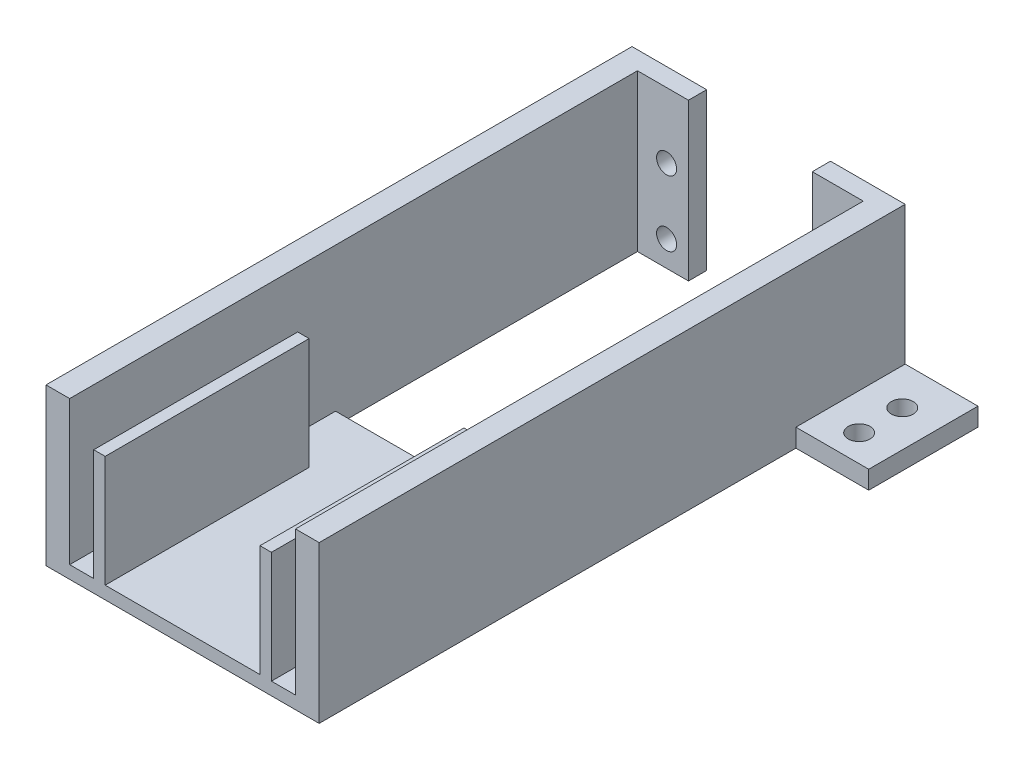
ISO-10303-21;
HEADER;
FILE_DESCRIPTION(('STEP AP214'),'2;1');
FILE_NAME('part.step','',(''),(''),'','','');
FILE_SCHEMA(('AUTOMOTIVE_DESIGN { 1 0 10303 214 1 1 1 1 }'));
ENDSEC;
DATA;
#1=APPLICATION_CONTEXT('core data for automotive mechanical design processes');
#2=APPLICATION_PROTOCOL_DEFINITION('international standard','automotive_design',2000,#1);
#3=PRODUCT_CONTEXT('',#1,'mechanical');
#4=PRODUCT('Part','Part','',(#3));
#5=PRODUCT_RELATED_PRODUCT_CATEGORY('part','',(#4));
#6=PRODUCT_DEFINITION_FORMATION('','',#4);
#7=PRODUCT_DEFINITION_CONTEXT('part definition',#1,'design');
#8=PRODUCT_DEFINITION('design','',#6,#7);
#9=PRODUCT_DEFINITION_SHAPE('','',#8);
#10=(LENGTH_UNIT() NAMED_UNIT(*) SI_UNIT(.MILLI.,.METRE.));
#11=(NAMED_UNIT(*) PLANE_ANGLE_UNIT() SI_UNIT($,.RADIAN.));
#12=(NAMED_UNIT(*) SI_UNIT($,.STERADIAN.) SOLID_ANGLE_UNIT());
#13=UNCERTAINTY_MEASURE_WITH_UNIT(LENGTH_MEASURE(1.E-05),#10,'distance_accuracy_value','');
#14=(GEOMETRIC_REPRESENTATION_CONTEXT(3) GLOBAL_UNCERTAINTY_ASSIGNED_CONTEXT((#13)) GLOBAL_UNIT_ASSIGNED_CONTEXT((#10,
#11,#12)) REPRESENTATION_CONTEXT('',''));
#15=CARTESIAN_POINT('',(0.,0.,0.));
#16=DIRECTION('',(0.,0.,1.));
#17=DIRECTION('',(1.,0.,0.));
#18=AXIS2_PLACEMENT_3D('',#15,#16,#17);
#19=CARTESIAN_POINT('',(3.60000000000001,3.50000000000002,167.9));
#20=DIRECTION('',(0.,-1.,0.));
#21=DIRECTION('',(0.,0.,-1.));
#22=AXIS2_PLACEMENT_3D('',#19,#20,#21);
#23=PLANE('',#22);
#24=DIRECTION('',(-1.,0.,0.));
#25=VECTOR('',#24,1.);
#26=CARTESIAN_POINT('',(3.60000000000001,3.50000000000002,160.9));
#27=LINE('',#26,#25);
#28=CARTESIAN_POINT('',(68.5,3.50000000000002,160.9));
#29=VERTEX_POINT('',#28);
#30=CARTESIAN_POINT('',(61.8901200344411,3.50000000000001,160.9));
#31=VERTEX_POINT('',#30);
#32=EDGE_CURVE('E616',#29,#31,#27,.T.);
#33=ORIENTED_EDGE('',*,*,#32,.F.);
#34=DIRECTION('',(0.,0.,-1.));
#35=VECTOR('',#34,1.);
#36=CARTESIAN_POINT('',(68.5,3.50000000000002,167.9));
#37=LINE('',#36,#35);
#38=CARTESIAN_POINT('',(68.5,3.50000000000001,87.9));
#39=VERTEX_POINT('',#38);
#40=EDGE_CURVE('E295',#29,#39,#37,.T.);
#41=ORIENTED_EDGE('',*,*,#40,.T.);
#42=DIRECTION('',(1.,0.,0.));
#43=VECTOR('',#42,1.);
#44=CARTESIAN_POINT('',(3.60000000000001,3.50000000000001,87.9));
#45=LINE('',#44,#43);
#46=CARTESIAN_POINT('',(6.5,3.50000000000001,87.9));
#47=VERTEX_POINT('',#46);
#48=EDGE_CURVE('E285',#47,#39,#45,.T.);
#49=ORIENTED_EDGE('',*,*,#48,.F.);
#50=DIRECTION('',(0.,0.,1.));
#51=VECTOR('',#50,1.);
#52=CARTESIAN_POINT('',(6.5,3.50000000000002,167.9));
#53=LINE('',#52,#51);
#54=CARTESIAN_POINT('',(6.5,3.50000000000002,160.9));
#55=VERTEX_POINT('',#54);
#56=EDGE_CURVE('E293',#47,#55,#53,.T.);
#57=ORIENTED_EDGE('',*,*,#56,.T.);
#58=CARTESIAN_POINT('',(13.11,3.50000000000001,160.9));
#59=VERTEX_POINT('',#58);
#60=EDGE_CURVE('E626',#59,#55,#27,.T.);
#61=ORIENTED_EDGE('',*,*,#60,.F.);
#62=DIRECTION('',(0.,0.,1.));
#63=VECTOR('',#62,1.);
#64=CARTESIAN_POINT('',(13.11,3.50000000000003,104.9));
#65=LINE('',#64,#63);
#66=CARTESIAN_POINT('',(13.11,3.50000000000001,104.9));
#67=VERTEX_POINT('',#66);
#68=EDGE_CURVE('E650',#67,#59,#65,.T.);
#69=ORIENTED_EDGE('',*,*,#68,.F.);
#70=DIRECTION('',(-1.,0.,0.));
#71=VECTOR('',#70,1.);
#72=CARTESIAN_POINT('',(16.25,3.50000000000002,104.9));
#73=LINE('',#72,#71);
#74=CARTESIAN_POINT('',(16.25,3.50000000000001,104.9));
#75=VERTEX_POINT('',#74);
#76=EDGE_CURVE('E70',#75,#67,#73,.T.);
#77=ORIENTED_EDGE('',*,*,#76,.F.);
#78=DIRECTION('',(0.,0.,1.));
#79=VECTOR('',#78,1.);
#80=CARTESIAN_POINT('',(16.25,3.50000000000002,104.9));
#81=LINE('',#80,#79);
#82=CARTESIAN_POINT('',(16.25,3.50000000000001,160.9));
#83=VERTEX_POINT('',#82);
#84=EDGE_CURVE('E654',#75,#83,#81,.T.);
#85=ORIENTED_EDGE('',*,*,#84,.T.);
#86=CARTESIAN_POINT('',(58.75,3.50000000000002,160.9));
#87=VERTEX_POINT('',#86);
#88=EDGE_CURVE('E625',#87,#83,#27,.T.);
#89=ORIENTED_EDGE('',*,*,#88,.F.);
#90=DIRECTION('',(0.,0.,1.));
#91=VECTOR('',#90,1.);
#92=CARTESIAN_POINT('',(58.75,3.50000000000002,104.9));
#93=LINE('',#92,#91);
#94=CARTESIAN_POINT('',(58.75,3.50000000000001,104.9));
#95=VERTEX_POINT('',#94);
#96=EDGE_CURVE('E621',#95,#87,#93,.T.);
#97=ORIENTED_EDGE('',*,*,#96,.F.);
#98=DIRECTION('',(-1.,0.,0.));
#99=VECTOR('',#98,1.);
#100=CARTESIAN_POINT('',(58.75,3.50000000000002,104.9));
#101=LINE('',#100,#99);
#102=CARTESIAN_POINT('',(61.8901200344411,3.50000000000001,104.9));
#103=VERTEX_POINT('',#102);
#104=EDGE_CURVE('E675',#103,#95,#101,.T.);
#105=ORIENTED_EDGE('',*,*,#104,.F.);
#106=DIRECTION('',(0.,0.,1.));
#107=VECTOR('',#106,1.);
#108=CARTESIAN_POINT('',(61.8901200344411,3.50000000000002,104.9));
#109=LINE('',#108,#107);
#110=EDGE_CURVE('E615',#103,#31,#109,.T.);
#111=ORIENTED_EDGE('',*,*,#110,.T.);
#112=EDGE_LOOP('',(#33,#41,#49,#57,#61,#69,#77,#85,#89,#97,#105,#111));
#113=FACE_BOUND('',#112,.T.);
#114=ADVANCED_FACE('F47',(#113),#23,.F.);
#115=CARTESIAN_POINT('',(75.,0.,5.));
#116=DIRECTION('',(-1.,0.,0.));
#117=DIRECTION('',(0.,-1.,0.));
#118=AXIS2_PLACEMENT_3D('',#115,#116,#117);
#119=PLANE('',#118);
#120=DIRECTION('',(0.,1.,0.));
#121=VECTOR('',#120,1.);
#122=CARTESIAN_POINT('',(75.,43.,160.9));
#123=LINE('',#122,#121);
#124=CARTESIAN_POINT('',(75.,0.,160.9));
#125=VERTEX_POINT('',#124);
#126=CARTESIAN_POINT('',(75.,43.,160.9));
#127=VERTEX_POINT('',#126);
#128=EDGE_CURVE('E252',#125,#127,#123,.T.);
#129=ORIENTED_EDGE('',*,*,#128,.F.);
#130=DIRECTION('',(0.,0.,-1.));
#131=VECTOR('',#130,1.);
#132=CARTESIAN_POINT('',(75.,0.,5.));
#133=LINE('',#132,#131);
#134=CARTESIAN_POINT('',(75.,0.,30.));
#135=VERTEX_POINT('',#134);
#136=EDGE_CURVE('E250',#125,#135,#133,.T.);
#137=ORIENTED_EDGE('',*,*,#136,.T.);
#138=DIRECTION('',(0.,-1.,0.));
#139=VECTOR('',#138,1.);
#140=CARTESIAN_POINT('',(75.,5.00000000000002,30.));
#141=LINE('',#140,#139);
#142=CARTESIAN_POINT('',(75.,5.00000000000002,30.));
#143=VERTEX_POINT('',#142);
#144=EDGE_CURVE('E569',#143,#135,#141,.T.);
#145=ORIENTED_EDGE('',*,*,#144,.F.);
#146=DIRECTION('',(0.,0.,1.));
#147=VECTOR('',#146,1.);
#148=CARTESIAN_POINT('',(75.,5.00000000000002,0.));
#149=LINE('',#148,#147);
#150=CARTESIAN_POINT('',(75.,5.00000000000002,0.));
#151=VERTEX_POINT('',#150);
#152=EDGE_CURVE('E567',#151,#143,#149,.T.);
#153=ORIENTED_EDGE('',*,*,#152,.F.);
#154=DIRECTION('',(0.,1.,0.));
#155=VECTOR('',#154,1.);
#156=CARTESIAN_POINT('',(75.,0.,0.));
#157=LINE('',#156,#155);
#158=CARTESIAN_POINT('',(75.,43.,0.));
#159=VERTEX_POINT('',#158);
#160=EDGE_CURVE('E449',#151,#159,#157,.T.);
#161=ORIENTED_EDGE('',*,*,#160,.T.);
#162=DIRECTION('',(0.,0.,-1.));
#163=VECTOR('',#162,1.);
#164=CARTESIAN_POINT('',(75.,43.,5.));
#165=LINE('',#164,#163);
#166=EDGE_CURVE('E434',#127,#159,#165,.T.);
#167=ORIENTED_EDGE('',*,*,#166,.F.);
#168=EDGE_LOOP('',(#129,#137,#145,#153,#161,#167));
#169=FACE_BOUND('',#168,.T.);
#170=ADVANCED_FACE('F504',(#169),#119,.F.);
#171=CARTESIAN_POINT('',(6.5,43.,167.9));
#172=DIRECTION('',(-1.,0.,0.));
#173=DIRECTION('',(0.,0.,1.));
#174=AXIS2_PLACEMENT_3D('',#171,#172,#173);
#175=PLANE('',#174);
#176=DIRECTION('',(0.,1.,0.));
#177=VECTOR('',#176,1.);
#178=CARTESIAN_POINT('',(6.5,43.,160.9));
#179=LINE('',#178,#177);
#180=CARTESIAN_POINT('',(6.5,43.,160.9));
#181=VERTEX_POINT('',#180);
#182=EDGE_CURVE('E1081',#55,#181,#179,.T.);
#183=ORIENTED_EDGE('',*,*,#182,.F.);
#184=ORIENTED_EDGE('',*,*,#56,.F.);
#185=DIRECTION('',(0.,1.,0.));
#186=VECTOR('',#185,1.);
#187=CARTESIAN_POINT('',(6.5,43.,87.9));
#188=LINE('',#187,#186);
#189=CARTESIAN_POINT('',(6.5,0.,87.9));
#190=VERTEX_POINT('',#189);
#191=EDGE_CURVE('E56',#190,#47,#188,.T.);
#192=ORIENTED_EDGE('',*,*,#191,.F.);
#193=DIRECTION('',(0.,0.,-1.));
#194=VECTOR('',#193,1.);
#195=CARTESIAN_POINT('',(6.5,0.,167.9));
#196=LINE('',#195,#194);
#197=CARTESIAN_POINT('',(6.5,0.,5.));
#198=VERTEX_POINT('',#197);
#199=EDGE_CURVE('E309',#190,#198,#196,.T.);
#200=ORIENTED_EDGE('',*,*,#199,.T.);
#201=DIRECTION('',(0.,1.,0.));
#202=VECTOR('',#201,1.);
#203=CARTESIAN_POINT('',(6.5,43.,5.));
#204=LINE('',#203,#202);
#205=CARTESIAN_POINT('',(6.5,43.,5.));
#206=VERTEX_POINT('',#205);
#207=EDGE_CURVE('E312',#198,#206,#204,.T.);
#208=ORIENTED_EDGE('',*,*,#207,.T.);
#209=DIRECTION('',(0.,0.,-1.));
#210=VECTOR('',#209,1.);
#211=CARTESIAN_POINT('',(6.5,43.,167.9));
#212=LINE('',#211,#210);
#213=EDGE_CURVE('E301',#181,#206,#212,.T.);
#214=ORIENTED_EDGE('',*,*,#213,.F.);
#215=EDGE_LOOP('',(#183,#184,#192,#200,#208,#214));
#216=FACE_BOUND('',#215,.T.);
#217=ADVANCED_FACE('F476',(#216),#175,.F.);
#218=CARTESIAN_POINT('',(68.5,43.,167.9));
#219=DIRECTION('',(1.,0.,0.));
#220=DIRECTION('',(0.,0.,-1.));
#221=AXIS2_PLACEMENT_3D('',#218,#219,#220);
#222=PLANE('',#221);
#223=DIRECTION('',(0.,-1.,0.));
#224=VECTOR('',#223,1.);
#225=CARTESIAN_POINT('',(68.5,43.,160.9));
#226=LINE('',#225,#224);
#227=CARTESIAN_POINT('',(68.5,43.,160.9));
#228=VERTEX_POINT('',#227);
#229=EDGE_CURVE('E613',#228,#29,#226,.T.);
#230=ORIENTED_EDGE('',*,*,#229,.F.);
#231=DIRECTION('',(0.,0.,-1.));
#232=VECTOR('',#231,1.);
#233=CARTESIAN_POINT('',(68.5,43.,167.9));
#234=LINE('',#233,#232);
#235=CARTESIAN_POINT('',(68.5,43.,5.));
#236=VERTEX_POINT('',#235);
#237=EDGE_CURVE('E406',#228,#236,#234,.T.);
#238=ORIENTED_EDGE('',*,*,#237,.T.);
#239=DIRECTION('',(0.,-1.,0.));
#240=VECTOR('',#239,1.);
#241=CARTESIAN_POINT('',(68.5,43.,5.));
#242=LINE('',#241,#240);
#243=CARTESIAN_POINT('',(68.5,0.,5.));
#244=VERTEX_POINT('',#243);
#245=EDGE_CURVE('E402',#236,#244,#242,.T.);
#246=ORIENTED_EDGE('',*,*,#245,.T.);
#247=DIRECTION('',(0.,0.,-1.));
#248=VECTOR('',#247,1.);
#249=CARTESIAN_POINT('',(68.5,0.,167.9));
#250=LINE('',#249,#248);
#251=CARTESIAN_POINT('',(68.5,0.,87.9));
#252=VERTEX_POINT('',#251);
#253=EDGE_CURVE('E409',#252,#244,#250,.T.);
#254=ORIENTED_EDGE('',*,*,#253,.F.);
#255=DIRECTION('',(0.,-1.,0.));
#256=VECTOR('',#255,1.);
#257=CARTESIAN_POINT('',(68.5,3.50000000000001,87.9));
#258=LINE('',#257,#256);
#259=EDGE_CURVE('E303',#39,#252,#258,.T.);
#260=ORIENTED_EDGE('',*,*,#259,.F.);
#261=ORIENTED_EDGE('',*,*,#40,.F.);
#262=EDGE_LOOP('',(#230,#238,#246,#254,#260,#261));
#263=FACE_BOUND('',#262,.T.);
#264=ADVANCED_FACE('F470',(#263),#222,.F.);
#265=CARTESIAN_POINT('',(0.,0.,5.));
#266=DIRECTION('',(0.,1.,0.));
#267=DIRECTION('',(0.,0.,1.));
#268=AXIS2_PLACEMENT_3D('',#265,#266,#267);
#269=PLANE('',#268);
#270=CARTESIAN_POINT('',(-10.,0.,10.799084074057));
#271=DIRECTION('',(0.,1.,0.));
#272=DIRECTION('',(0.,0.,1.));
#273=AXIS2_PLACEMENT_3D('',#270,#271,#272);
#274=CIRCLE('',#273,3.);
#275=CARTESIAN_POINT('',(-10.,0.,13.799084074057));
#276=VERTEX_POINT('',#275);
#277=EDGE_CURVE('E581',#276,#276,#274,.T.);
#278=ORIENTED_EDGE('',*,*,#277,.T.);
#279=EDGE_LOOP('',(#278));
#280=FACE_BOUND('',#279,.T.);
#281=CARTESIAN_POINT('',(85.,0.,22.6338304347611));
#282=DIRECTION('',(0.,1.,0.));
#283=DIRECTION('',(0.,0.,1.));
#284=AXIS2_PLACEMENT_3D('',#281,#282,#283);
#285=CIRCLE('',#284,3.00000000000001);
#286=CARTESIAN_POINT('',(85.,0.,25.6338304347611));
#287=VERTEX_POINT('',#286);
#288=EDGE_CURVE('E697',#287,#287,#285,.T.);
#289=ORIENTED_EDGE('',*,*,#288,.T.);
#290=EDGE_LOOP('',(#289));
#291=FACE_BOUND('',#290,.T.);
#292=CARTESIAN_POINT('',(85.,0.,10.799084074057));
#293=DIRECTION('',(0.,1.,0.));
#294=DIRECTION('',(0.,0.,1.));
#295=AXIS2_PLACEMENT_3D('',#292,#293,#294);
#296=CIRCLE('',#295,3.00000000000001);
#297=CARTESIAN_POINT('',(85.,0.,13.799084074057));
#298=VERTEX_POINT('',#297);
#299=EDGE_CURVE('E701',#298,#298,#296,.T.);
#300=ORIENTED_EDGE('',*,*,#299,.T.);
#301=EDGE_LOOP('',(#300));
#302=FACE_BOUND('',#301,.T.);
#303=CARTESIAN_POINT('',(-10.,0.,22.6338304347611));
#304=DIRECTION('',(0.,1.,0.));
#305=DIRECTION('',(0.,0.,1.));
#306=AXIS2_PLACEMENT_3D('',#303,#304,#305);
#307=CIRCLE('',#306,3.);
#308=CARTESIAN_POINT('',(-10.,0.,25.6338304347611));
#309=VERTEX_POINT('',#308);
#310=EDGE_CURVE('E574',#309,#309,#307,.T.);
#311=ORIENTED_EDGE('',*,*,#310,.T.);
#312=EDGE_LOOP('',(#311));
#313=FACE_BOUND('',#312,.T.);
#314=DIRECTION('',(1.,0.,0.));
#315=VECTOR('',#314,1.);
#316=CARTESIAN_POINT('',(0.,0.,160.9));
#317=LINE('',#316,#315);
#318=CARTESIAN_POINT('',(0.,0.,160.9));
#319=VERTEX_POINT('',#318);
#320=EDGE_CURVE('E234',#319,#125,#317,.T.);
#321=ORIENTED_EDGE('',*,*,#320,.F.);
#322=DIRECTION('',(0.,0.,-1.));
#323=VECTOR('',#322,1.);
#324=CARTESIAN_POINT('',(0.,0.,5.));
#325=LINE('',#324,#323);
#326=CARTESIAN_POINT('',(0.,0.,30.));
#327=VERTEX_POINT('',#326);
#328=EDGE_CURVE('E247',#319,#327,#325,.T.);
#329=ORIENTED_EDGE('',*,*,#328,.T.);
#330=DIRECTION('',(1.,0.,0.));
#331=VECTOR('',#330,1.);
#332=CARTESIAN_POINT('',(-20.,0.,30.));
#333=LINE('',#332,#331);
#334=CARTESIAN_POINT('',(-20.,0.,30.));
#335=VERTEX_POINT('',#334);
#336=EDGE_CURVE('E370',#335,#327,#333,.T.);
#337=ORIENTED_EDGE('',*,*,#336,.F.);
#338=DIRECTION('',(0.,0.,1.));
#339=VECTOR('',#338,1.);
#340=CARTESIAN_POINT('',(-20.,0.,0.));
#341=LINE('',#340,#339);
#342=CARTESIAN_POINT('',(-20.,0.,0.));
#343=VERTEX_POINT('',#342);
#344=EDGE_CURVE('E369',#343,#335,#341,.T.);
#345=ORIENTED_EDGE('',*,*,#344,.F.);
#346=DIRECTION('',(1.,0.,0.));
#347=VECTOR('',#346,1.);
#348=CARTESIAN_POINT('',(0.,0.,0.));
#349=LINE('',#348,#347);
#350=CARTESIAN_POINT('',(20.5,0.,0.));
#351=VERTEX_POINT('',#350);
#352=EDGE_CURVE('E338',#343,#351,#349,.T.);
#353=ORIENTED_EDGE('',*,*,#352,.T.);
#354=DIRECTION('',(0.,0.,-1.));
#355=VECTOR('',#354,1.);
#356=CARTESIAN_POINT('',(20.5,0.,5.));
#357=LINE('',#356,#355);
#358=CARTESIAN_POINT('',(20.5,0.,5.));
#359=VERTEX_POINT('',#358);
#360=EDGE_CURVE('E274',#359,#351,#357,.T.);
#361=ORIENTED_EDGE('',*,*,#360,.F.);
#362=DIRECTION('',(1.,0.,0.));
#363=VECTOR('',#362,1.);
#364=CARTESIAN_POINT('',(0.,0.,5.));
#365=LINE('',#364,#363);
#366=EDGE_CURVE('E325',#198,#359,#365,.T.);
#367=ORIENTED_EDGE('',*,*,#366,.F.);
#368=ORIENTED_EDGE('',*,*,#199,.F.);
#369=DIRECTION('',(1.,0.,0.));
#370=VECTOR('',#369,1.);
#371=CARTESIAN_POINT('',(3.60000000000001,0.,87.9));
#372=LINE('',#371,#370);
#373=EDGE_CURVE('E287',#190,#252,#372,.T.);
#374=ORIENTED_EDGE('',*,*,#373,.T.);
#375=ORIENTED_EDGE('',*,*,#253,.T.);
#376=DIRECTION('',(1.,0.,0.));
#377=VECTOR('',#376,1.);
#378=CARTESIAN_POINT('',(0.,0.,5.));
#379=LINE('',#378,#377);
#380=CARTESIAN_POINT('',(54.5,0.,5.));
#381=VERTEX_POINT('',#380);
#382=EDGE_CURVE('E426',#381,#244,#379,.T.);
#383=ORIENTED_EDGE('',*,*,#382,.F.);
#384=DIRECTION('',(0.,0.,-1.));
#385=VECTOR('',#384,1.);
#386=CARTESIAN_POINT('',(54.5,0.,5.));
#387=LINE('',#386,#385);
#388=CARTESIAN_POINT('',(54.5,0.,0.));
#389=VERTEX_POINT('',#388);
#390=EDGE_CURVE('E460',#381,#389,#387,.T.);
#391=ORIENTED_EDGE('',*,*,#390,.T.);
#392=DIRECTION('',(1.,0.,0.));
#393=VECTOR('',#392,1.);
#394=CARTESIAN_POINT('',(0.,0.,0.));
#395=LINE('',#394,#393);
#396=CARTESIAN_POINT('',(95.,0.,0.));
#397=VERTEX_POINT('',#396);
#398=EDGE_CURVE('E446',#389,#397,#395,.T.);
#399=ORIENTED_EDGE('',*,*,#398,.T.);
#400=DIRECTION('',(0.,0.,-1.));
#401=VECTOR('',#400,1.);
#402=CARTESIAN_POINT('',(95.,0.,0.));
#403=LINE('',#402,#401);
#404=CARTESIAN_POINT('',(95.,0.,30.));
#405=VERTEX_POINT('',#404);
#406=EDGE_CURVE('E584',#405,#397,#403,.T.);
#407=ORIENTED_EDGE('',*,*,#406,.F.);
#408=DIRECTION('',(-1.,0.,0.));
#409=VECTOR('',#408,1.);
#410=CARTESIAN_POINT('',(95.,0.,30.));
#411=LINE('',#410,#409);
#412=EDGE_CURVE('E587',#405,#135,#411,.T.);
#413=ORIENTED_EDGE('',*,*,#412,.T.);
#414=ORIENTED_EDGE('',*,*,#136,.F.);
#415=EDGE_LOOP('',(#321,#329,#337,#345,#353,#361,#367,#368,#374,#375,#383,#391,#399,#407,#413,#414));
#416=FACE_BOUND('',#415,.T.);
#417=ADVANCED_FACE('F245',(#280,#291,#302,#313,#416),#269,.F.);
#418=CARTESIAN_POINT('',(0.,43.,5.));
#419=DIRECTION('',(0.,1.,0.));
#420=DIRECTION('',(0.,0.,1.));
#421=AXIS2_PLACEMENT_3D('',#418,#419,#420);
#422=PLANE('',#421);
#423=DIRECTION('',(0.,0.,-1.));
#424=VECTOR('',#423,1.);
#425=CARTESIAN_POINT('',(0.,43.,5.));
#426=LINE('',#425,#424);
#427=CARTESIAN_POINT('',(0.,43.,160.9));
#428=VERTEX_POINT('',#427);
#429=CARTESIAN_POINT('',(0.,43.,0.));
#430=VERTEX_POINT('',#429);
#431=EDGE_CURVE('E259',#428,#430,#426,.T.);
#432=ORIENTED_EDGE('',*,*,#431,.F.);
#433=DIRECTION('',(-1.,0.,0.));
#434=VECTOR('',#433,1.);
#435=CARTESIAN_POINT('',(0.,43.,160.9));
#436=LINE('',#435,#434);
#437=EDGE_CURVE('E237',#181,#428,#436,.T.);
#438=ORIENTED_EDGE('',*,*,#437,.F.);
#439=ORIENTED_EDGE('',*,*,#213,.T.);
#440=DIRECTION('',(1.,0.,0.));
#441=VECTOR('',#440,1.);
#442=CARTESIAN_POINT('',(0.,43.,5.));
#443=LINE('',#442,#441);
#444=CARTESIAN_POINT('',(20.5,43.,5.));
#445=VERTEX_POINT('',#444);
#446=EDGE_CURVE('E260',#206,#445,#443,.T.);
#447=ORIENTED_EDGE('',*,*,#446,.T.);
#448=DIRECTION('',(0.,0.,-1.));
#449=VECTOR('',#448,1.);
#450=CARTESIAN_POINT('',(20.5,43.,5.));
#451=LINE('',#450,#449);
#452=CARTESIAN_POINT('',(20.5,43.,0.));
#453=VERTEX_POINT('',#452);
#454=EDGE_CURVE('E264',#445,#453,#451,.T.);
#455=ORIENTED_EDGE('',*,*,#454,.T.);
#456=DIRECTION('',(1.,0.,0.));
#457=VECTOR('',#456,1.);
#458=CARTESIAN_POINT('',(0.,43.,0.));
#459=LINE('',#458,#457);
#460=EDGE_CURVE('E345',#430,#453,#459,.T.);
#461=ORIENTED_EDGE('',*,*,#460,.F.);
#462=EDGE_LOOP('',(#432,#438,#439,#447,#455,#461));
#463=FACE_BOUND('',#462,.T.);
#464=ADVANCED_FACE('F359',(#463),#422,.T.);
#465=ORIENTED_EDGE('',*,*,#237,.F.);
#466=EDGE_CURVE('E565',#127,#228,#436,.T.);
#467=ORIENTED_EDGE('',*,*,#466,.F.);
#468=ORIENTED_EDGE('',*,*,#166,.T.);
#469=DIRECTION('',(1.,0.,0.));
#470=VECTOR('',#469,1.);
#471=CARTESIAN_POINT('',(0.,43.,0.));
#472=LINE('',#471,#470);
#473=CARTESIAN_POINT('',(54.5,43.,0.));
#474=VERTEX_POINT('',#473);
#475=EDGE_CURVE('E438',#474,#159,#472,.T.);
#476=ORIENTED_EDGE('',*,*,#475,.F.);
#477=DIRECTION('',(0.,0.,-1.));
#478=VECTOR('',#477,1.);
#479=CARTESIAN_POINT('',(54.5,43.,5.));
#480=LINE('',#479,#478);
#481=CARTESIAN_POINT('',(54.5,43.,5.));
#482=VERTEX_POINT('',#481);
#483=EDGE_CURVE('E463',#482,#474,#480,.T.);
#484=ORIENTED_EDGE('',*,*,#483,.F.);
#485=DIRECTION('',(1.,0.,0.));
#486=VECTOR('',#485,1.);
#487=CARTESIAN_POINT('',(0.,43.,5.));
#488=LINE('',#487,#486);
#489=EDGE_CURVE('E417',#482,#236,#488,.T.);
#490=ORIENTED_EDGE('',*,*,#489,.T.);
#491=EDGE_LOOP('',(#465,#467,#468,#476,#484,#490));
#492=FACE_BOUND('',#491,.T.);
#493=ADVANCED_FACE('F561',(#492),#422,.T.);
#494=CARTESIAN_POINT('',(0.,0.,5.));
#495=DIRECTION('',(-1.,0.,0.));
#496=DIRECTION('',(0.,0.,1.));
#497=AXIS2_PLACEMENT_3D('',#494,#495,#496);
#498=PLANE('',#497);
#499=ORIENTED_EDGE('',*,*,#328,.F.);
#500=DIRECTION('',(0.,-1.,0.));
#501=VECTOR('',#500,1.);
#502=CARTESIAN_POINT('',(0.,43.,160.9));
#503=LINE('',#502,#501);
#504=EDGE_CURVE('E231',#428,#319,#503,.T.);
#505=ORIENTED_EDGE('',*,*,#504,.F.);
#506=ORIENTED_EDGE('',*,*,#431,.T.);
#507=DIRECTION('',(0.,1.,0.));
#508=VECTOR('',#507,1.);
#509=CARTESIAN_POINT('',(0.,0.,0.));
#510=LINE('',#509,#508);
#511=CARTESIAN_POINT('',(0.,5.,0.));
#512=VERTEX_POINT('',#511);
#513=EDGE_CURVE('E269',#512,#430,#510,.T.);
#514=ORIENTED_EDGE('',*,*,#513,.F.);
#515=DIRECTION('',(0.,0.,-1.));
#516=VECTOR('',#515,1.);
#517=CARTESIAN_POINT('',(0.,5.,0.));
#518=LINE('',#517,#516);
#519=CARTESIAN_POINT('',(0.,5.,30.));
#520=VERTEX_POINT('',#519);
#521=EDGE_CURVE('E380',#520,#512,#518,.T.);
#522=ORIENTED_EDGE('',*,*,#521,.F.);
#523=DIRECTION('',(0.,1.,0.));
#524=VECTOR('',#523,1.);
#525=CARTESIAN_POINT('',(0.,0.,30.));
#526=LINE('',#525,#524);
#527=EDGE_CURVE('E256',#327,#520,#526,.T.);
#528=ORIENTED_EDGE('',*,*,#527,.F.);
#529=EDGE_LOOP('',(#499,#505,#506,#514,#522,#528));
#530=FACE_BOUND('',#529,.T.);
#531=ADVANCED_FACE('F254',(#530),#498,.T.);
#532=CARTESIAN_POINT('',(61.8901200344411,34.1386720145067,104.9));
#533=DIRECTION('',(-1.,0.,0.));
#534=DIRECTION('',(0.,0.,1.));
#535=AXIS2_PLACEMENT_3D('',#532,#533,#534);
#536=PLANE('',#535);
#537=DIRECTION('',(0.,1.,0.));
#538=VECTOR('',#537,1.);
#539=CARTESIAN_POINT('',(61.8901200344411,34.1386720145067,160.9));
#540=LINE('',#539,#538);
#541=CARTESIAN_POINT('',(61.8901200344411,34.1386720145067,160.9));
#542=VERTEX_POINT('',#541);
#543=EDGE_CURVE('E623',#31,#542,#540,.T.);
#544=ORIENTED_EDGE('',*,*,#543,.F.);
#545=ORIENTED_EDGE('',*,*,#110,.F.);
#546=DIRECTION('',(0.,-1.,0.));
#547=VECTOR('',#546,1.);
#548=CARTESIAN_POINT('',(61.8901200344411,34.1386720145067,104.9));
#549=LINE('',#548,#547);
#550=CARTESIAN_POINT('',(61.8901200344411,34.1386720145067,104.9));
#551=VERTEX_POINT('',#550);
#552=EDGE_CURVE('E633',#551,#103,#549,.T.);
#553=ORIENTED_EDGE('',*,*,#552,.F.);
#554=DIRECTION('',(0.,0.,1.));
#555=VECTOR('',#554,1.);
#556=CARTESIAN_POINT('',(61.8901200344411,34.1386720145067,104.9));
#557=LINE('',#556,#555);
#558=EDGE_CURVE('E665',#551,#542,#557,.T.);
#559=ORIENTED_EDGE('',*,*,#558,.T.);
#560=EDGE_LOOP('',(#544,#545,#553,#559));
#561=FACE_BOUND('',#560,.T.);
#562=ADVANCED_FACE('F862',(#561),#536,.F.);
#563=CARTESIAN_POINT('',(58.75,34.1386720145067,104.9));
#564=DIRECTION('',(1.,0.,0.));
#565=DIRECTION('',(0.,1.,0.));
#566=AXIS2_PLACEMENT_3D('',#563,#564,#565);
#567=PLANE('',#566);
#568=DIRECTION('',(0.,-1.,0.));
#569=VECTOR('',#568,1.);
#570=CARTESIAN_POINT('',(58.75,34.1386720145067,160.9));
#571=LINE('',#570,#569);
#572=CARTESIAN_POINT('',(58.75,34.1386720145067,160.9));
#573=VERTEX_POINT('',#572);
#574=EDGE_CURVE('E1083',#573,#87,#571,.T.);
#575=ORIENTED_EDGE('',*,*,#574,.F.);
#576=DIRECTION('',(0.,0.,1.));
#577=VECTOR('',#576,1.);
#578=CARTESIAN_POINT('',(58.75,34.1386720145067,104.9));
#579=LINE('',#578,#577);
#580=CARTESIAN_POINT('',(58.75,34.1386720145067,104.9));
#581=VERTEX_POINT('',#580);
#582=EDGE_CURVE('E661',#581,#573,#579,.T.);
#583=ORIENTED_EDGE('',*,*,#582,.F.);
#584=DIRECTION('',(0.,1.,0.));
#585=VECTOR('',#584,1.);
#586=CARTESIAN_POINT('',(58.75,34.1386720145067,104.9));
#587=LINE('',#586,#585);
#588=EDGE_CURVE('E672',#95,#581,#587,.T.);
#589=ORIENTED_EDGE('',*,*,#588,.F.);
#590=ORIENTED_EDGE('',*,*,#96,.T.);
#591=EDGE_LOOP('',(#575,#583,#589,#590));
#592=FACE_BOUND('',#591,.T.);
#593=ADVANCED_FACE('F853',(#592),#567,.F.);
#594=CARTESIAN_POINT('',(58.75,34.1386720145067,104.9));
#595=DIRECTION('',(0.,-1.,0.));
#596=DIRECTION('',(0.,0.,-1.));
#597=AXIS2_PLACEMENT_3D('',#594,#595,#596);
#598=PLANE('',#597);
#599=DIRECTION('',(-1.,0.,0.));
#600=VECTOR('',#599,1.);
#601=CARTESIAN_POINT('',(58.75,34.1386720145067,160.9));
#602=LINE('',#601,#600);
#603=EDGE_CURVE('E1074',#542,#573,#602,.T.);
#604=ORIENTED_EDGE('',*,*,#603,.F.);
#605=ORIENTED_EDGE('',*,*,#558,.F.);
#606=DIRECTION('',(1.,0.,0.));
#607=VECTOR('',#606,1.);
#608=CARTESIAN_POINT('',(58.75,34.1386720145067,104.9));
#609=LINE('',#608,#607);
#610=EDGE_CURVE('E669',#581,#551,#609,.T.);
#611=ORIENTED_EDGE('',*,*,#610,.F.);
#612=ORIENTED_EDGE('',*,*,#582,.T.);
#613=EDGE_LOOP('',(#604,#605,#611,#612));
#614=FACE_BOUND('',#613,.T.);
#615=ADVANCED_FACE('F844',(#614),#598,.F.);
#616=CARTESIAN_POINT('',(16.25,34.1386720145067,104.9));
#617=DIRECTION('',(-1.,0.,0.));
#618=DIRECTION('',(0.,0.,1.));
#619=AXIS2_PLACEMENT_3D('',#616,#617,#618);
#620=PLANE('',#619);
#621=DIRECTION('',(0.,1.,0.));
#622=VECTOR('',#621,1.);
#623=CARTESIAN_POINT('',(16.25,34.1386720145067,160.9));
#624=LINE('',#623,#622);
#625=CARTESIAN_POINT('',(16.25,34.1386720145067,160.9));
#626=VERTEX_POINT('',#625);
#627=EDGE_CURVE('E62',#83,#626,#624,.T.);
#628=ORIENTED_EDGE('',*,*,#627,.F.);
#629=ORIENTED_EDGE('',*,*,#84,.F.);
#630=DIRECTION('',(0.,-1.,0.));
#631=VECTOR('',#630,1.);
#632=CARTESIAN_POINT('',(16.25,34.1386720145067,104.9));
#633=LINE('',#632,#631);
#634=CARTESIAN_POINT('',(16.25,34.1386720145067,104.9));
#635=VERTEX_POINT('',#634);
#636=EDGE_CURVE('E630',#635,#75,#633,.T.);
#637=ORIENTED_EDGE('',*,*,#636,.F.);
#638=DIRECTION('',(0.,0.,1.));
#639=VECTOR('',#638,1.);
#640=CARTESIAN_POINT('',(16.25,34.1386720145067,104.9));
#641=LINE('',#640,#639);
#642=EDGE_CURVE('E642',#635,#626,#641,.T.);
#643=ORIENTED_EDGE('',*,*,#642,.T.);
#644=EDGE_LOOP('',(#628,#629,#637,#643));
#645=FACE_BOUND('',#644,.T.);
#646=ADVANCED_FACE('F835',(#645),#620,.F.);
#647=CARTESIAN_POINT('',(13.11,34.1386720145067,104.9));
#648=DIRECTION('',(1.,0.,0.));
#649=DIRECTION('',(0.,1.,0.));
#650=AXIS2_PLACEMENT_3D('',#647,#648,#649);
#651=PLANE('',#650);
#652=DIRECTION('',(0.,-1.,0.));
#653=VECTOR('',#652,1.);
#654=CARTESIAN_POINT('',(13.11,34.1386720145067,160.9));
#655=LINE('',#654,#653);
#656=CARTESIAN_POINT('',(13.11,34.1386720145067,160.9));
#657=VERTEX_POINT('',#656);
#658=EDGE_CURVE('E1091',#657,#59,#655,.T.);
#659=ORIENTED_EDGE('',*,*,#658,.F.);
#660=DIRECTION('',(0.,0.,1.));
#661=VECTOR('',#660,1.);
#662=CARTESIAN_POINT('',(13.11,34.1386720145067,104.9));
#663=LINE('',#662,#661);
#664=CARTESIAN_POINT('',(13.11,34.1386720145067,104.9));
#665=VERTEX_POINT('',#664);
#666=EDGE_CURVE('E646',#665,#657,#663,.T.);
#667=ORIENTED_EDGE('',*,*,#666,.F.);
#668=DIRECTION('',(0.,1.,0.));
#669=VECTOR('',#668,1.);
#670=CARTESIAN_POINT('',(13.11,34.1386720145067,104.9));
#671=LINE('',#670,#669);
#672=EDGE_CURVE('E636',#67,#665,#671,.T.);
#673=ORIENTED_EDGE('',*,*,#672,.F.);
#674=ORIENTED_EDGE('',*,*,#68,.T.);
#675=EDGE_LOOP('',(#659,#667,#673,#674));
#676=FACE_BOUND('',#675,.T.);
#677=ADVANCED_FACE('F826',(#676),#651,.F.);
#678=CARTESIAN_POINT('',(16.25,34.1386720145067,104.9));
#679=DIRECTION('',(0.,-1.,0.));
#680=DIRECTION('',(0.,0.,-1.));
#681=AXIS2_PLACEMENT_3D('',#678,#679,#680);
#682=PLANE('',#681);
#683=DIRECTION('',(-1.,0.,0.));
#684=VECTOR('',#683,1.);
#685=CARTESIAN_POINT('',(16.25,34.1386720145067,160.9));
#686=LINE('',#685,#684);
#687=EDGE_CURVE('E11',#626,#657,#686,.T.);
#688=ORIENTED_EDGE('',*,*,#687,.F.);
#689=ORIENTED_EDGE('',*,*,#642,.F.);
#690=DIRECTION('',(1.,0.,0.));
#691=VECTOR('',#690,1.);
#692=CARTESIAN_POINT('',(16.25,34.1386720145067,104.9));
#693=LINE('',#692,#691);
#694=EDGE_CURVE('E639',#665,#635,#693,.T.);
#695=ORIENTED_EDGE('',*,*,#694,.F.);
#696=ORIENTED_EDGE('',*,*,#666,.T.);
#697=EDGE_LOOP('',(#688,#689,#695,#696));
#698=FACE_BOUND('',#697,.T.);
#699=ADVANCED_FACE('F821',(#698),#682,.F.);
#700=CARTESIAN_POINT('',(20.5,0.,5.));
#701=DIRECTION('',(-1.,0.,0.));
#702=DIRECTION('',(0.,0.,1.));
#703=AXIS2_PLACEMENT_3D('',#700,#701,#702);
#704=PLANE('',#703);
#705=DIRECTION('',(0.,1.,0.));
#706=VECTOR('',#705,1.);
#707=CARTESIAN_POINT('',(20.5,0.,0.));
#708=LINE('',#707,#706);
#709=EDGE_CURVE('E342',#351,#453,#708,.T.);
#710=ORIENTED_EDGE('',*,*,#709,.T.);
#711=ORIENTED_EDGE('',*,*,#454,.F.);
#712=DIRECTION('',(0.,1.,0.));
#713=VECTOR('',#712,1.);
#714=CARTESIAN_POINT('',(20.5,0.,5.));
#715=LINE('',#714,#713);
#716=EDGE_CURVE('E266',#359,#445,#715,.T.);
#717=ORIENTED_EDGE('',*,*,#716,.F.);
#718=ORIENTED_EDGE('',*,*,#360,.T.);
#719=EDGE_LOOP('',(#710,#711,#717,#718));
#720=FACE_BOUND('',#719,.T.);
#721=ADVANCED_FACE('F364',(#720),#704,.F.);
#722=CARTESIAN_POINT('',(14.5,25.,5.));
#723=DIRECTION('',(0.,0.,-1.));
#724=DIRECTION('',(-1.,0.,0.));
#725=AXIS2_PLACEMENT_3D('',#722,#723,#724);
#726=CYLINDRICAL_SURFACE('',#725,2.74999999999999);
#727=CARTESIAN_POINT('',(14.5,25.,5.));
#728=DIRECTION('',(0.,0.,1.));
#729=DIRECTION('',(1.,0.,0.));
#730=AXIS2_PLACEMENT_3D('',#727,#728,#729);
#731=CIRCLE('',#730,2.74999999999999);
#732=CARTESIAN_POINT('',(17.25,25.,5.));
#733=VERTEX_POINT('',#732);
#734=EDGE_CURVE('E321',#733,#733,#731,.T.);
#735=ORIENTED_EDGE('',*,*,#734,.T.);
#736=EDGE_LOOP('',(#735));
#737=FACE_BOUND('',#736,.T.);
#738=CARTESIAN_POINT('',(14.5,25.,0.));
#739=DIRECTION('',(0.,0.,1.));
#740=DIRECTION('',(1.,0.,0.));
#741=AXIS2_PLACEMENT_3D('',#738,#739,#740);
#742=CIRCLE('',#741,2.74999999999999);
#743=CARTESIAN_POINT('',(17.25,25.,0.));
#744=VERTEX_POINT('',#743);
#745=EDGE_CURVE('E334',#744,#744,#742,.T.);
#746=ORIENTED_EDGE('',*,*,#745,.F.);
#747=EDGE_LOOP('',(#746));
#748=FACE_BOUND('',#747,.T.);
#749=ADVANCED_FACE('F487',(#737,#748),#726,.F.);
#750=CARTESIAN_POINT('',(14.5,7.00000000000002,5.));
#751=DIRECTION('',(0.,0.,-1.));
#752=DIRECTION('',(-1.,0.,0.));
#753=AXIS2_PLACEMENT_3D('',#750,#751,#752);
#754=CYLINDRICAL_SURFACE('',#753,2.74999999999999);
#755=CARTESIAN_POINT('',(14.5,7.00000000000002,5.));
#756=DIRECTION('',(0.,0.,1.));
#757=DIRECTION('',(1.,0.,0.));
#758=AXIS2_PLACEMENT_3D('',#755,#756,#757);
#759=CIRCLE('',#758,2.74999999999999);
#760=CARTESIAN_POINT('',(17.25,7.00000000000002,5.));
#761=VERTEX_POINT('',#760);
#762=EDGE_CURVE('E317',#761,#761,#759,.T.);
#763=ORIENTED_EDGE('',*,*,#762,.T.);
#764=EDGE_LOOP('',(#763));
#765=FACE_BOUND('',#764,.T.);
#766=CARTESIAN_POINT('',(14.5,7.00000000000002,0.));
#767=DIRECTION('',(0.,0.,1.));
#768=DIRECTION('',(1.,0.,0.));
#769=AXIS2_PLACEMENT_3D('',#766,#767,#768);
#770=CIRCLE('',#769,2.74999999999999);
#771=CARTESIAN_POINT('',(17.25,7.00000000000002,0.));
#772=VERTEX_POINT('',#771);
#773=EDGE_CURVE('E316',#772,#772,#770,.T.);
#774=ORIENTED_EDGE('',*,*,#773,.F.);
#775=EDGE_LOOP('',(#774));
#776=FACE_BOUND('',#775,.T.);
#777=ADVANCED_FACE('F49',(#765,#776),#754,.F.);
#778=CARTESIAN_POINT('',(0.,0.,5.));
#779=DIRECTION('',(0.,0.,1.));
#780=DIRECTION('',(1.,0.,0.));
#781=AXIS2_PLACEMENT_3D('',#778,#779,#780);
#782=PLANE('',#781);
#783=ORIENTED_EDGE('',*,*,#207,.F.);
#784=ORIENTED_EDGE('',*,*,#366,.T.);
#785=ORIENTED_EDGE('',*,*,#716,.T.);
#786=ORIENTED_EDGE('',*,*,#446,.F.);
#787=EDGE_LOOP('',(#783,#784,#785,#786));
#788=FACE_BOUND('',#787,.T.);
#789=ORIENTED_EDGE('',*,*,#762,.F.);
#790=EDGE_LOOP('',(#789));
#791=FACE_BOUND('',#790,.T.);
#792=ORIENTED_EDGE('',*,*,#734,.F.);
#793=EDGE_LOOP('',(#792));
#794=FACE_BOUND('',#793,.T.);
#795=ADVANCED_FACE('F479',(#788,#791,#794),#782,.T.);
#796=CARTESIAN_POINT('',(0.,0.,0.));
#797=DIRECTION('',(0.,0.,1.));
#798=DIRECTION('',(1.,0.,0.));
#799=AXIS2_PLACEMENT_3D('',#796,#797,#798);
#800=PLANE('',#799);
#801=ORIENTED_EDGE('',*,*,#773,.T.);
#802=EDGE_LOOP('',(#801));
#803=FACE_BOUND('',#802,.T.);
#804=ORIENTED_EDGE('',*,*,#745,.T.);
#805=EDGE_LOOP('',(#804));
#806=FACE_BOUND('',#805,.T.);
#807=ORIENTED_EDGE('',*,*,#352,.F.);
#808=DIRECTION('',(0.,-1.,0.));
#809=VECTOR('',#808,1.);
#810=CARTESIAN_POINT('',(-20.,0.,0.));
#811=LINE('',#810,#809);
#812=CARTESIAN_POINT('',(-20.,5.,0.));
#813=VERTEX_POINT('',#812);
#814=EDGE_CURVE('E368',#813,#343,#811,.T.);
#815=ORIENTED_EDGE('',*,*,#814,.F.);
#816=DIRECTION('',(1.,0.,0.));
#817=VECTOR('',#816,1.);
#818=CARTESIAN_POINT('',(-20.,5.,0.));
#819=LINE('',#818,#817);
#820=EDGE_CURVE('E356',#813,#512,#819,.T.);
#821=ORIENTED_EDGE('',*,*,#820,.T.);
#822=ORIENTED_EDGE('',*,*,#513,.T.);
#823=ORIENTED_EDGE('',*,*,#460,.T.);
#824=ORIENTED_EDGE('',*,*,#709,.F.);
#825=EDGE_LOOP('',(#807,#815,#821,#822,#823,#824));
#826=FACE_BOUND('',#825,.T.);
#827=ADVANCED_FACE('F353',(#803,#806,#826),#800,.F.);
#828=CARTESIAN_POINT('',(3.60000000000001,3.50000000000001,87.9));
#829=DIRECTION('',(0.,0.,1.));
#830=DIRECTION('',(1.,0.,0.));
#831=AXIS2_PLACEMENT_3D('',#828,#829,#830);
#832=PLANE('',#831);
#833=ORIENTED_EDGE('',*,*,#373,.F.);
#834=ORIENTED_EDGE('',*,*,#191,.T.);
#835=ORIENTED_EDGE('',*,*,#48,.T.);
#836=ORIENTED_EDGE('',*,*,#259,.T.);
#837=EDGE_LOOP('',(#833,#834,#835,#836));
#838=FACE_BOUND('',#837,.T.);
#839=ADVANCED_FACE('F283',(#838),#832,.F.);
#840=CARTESIAN_POINT('',(54.5,0.,5.));
#841=DIRECTION('',(-1.,0.,0.));
#842=DIRECTION('',(0.,0.,1.));
#843=AXIS2_PLACEMENT_3D('',#840,#841,#842);
#844=PLANE('',#843);
#845=DIRECTION('',(0.,1.,0.));
#846=VECTOR('',#845,1.);
#847=CARTESIAN_POINT('',(54.5,0.,0.));
#848=LINE('',#847,#846);
#849=EDGE_CURVE('E442',#389,#474,#848,.T.);
#850=ORIENTED_EDGE('',*,*,#849,.F.);
#851=ORIENTED_EDGE('',*,*,#390,.F.);
#852=DIRECTION('',(0.,1.,0.));
#853=VECTOR('',#852,1.);
#854=CARTESIAN_POINT('',(54.5,0.,5.));
#855=LINE('',#854,#853);
#856=EDGE_CURVE('E422',#381,#482,#855,.T.);
#857=ORIENTED_EDGE('',*,*,#856,.T.);
#858=ORIENTED_EDGE('',*,*,#483,.T.);
#859=EDGE_LOOP('',(#850,#851,#857,#858));
#860=FACE_BOUND('',#859,.T.);
#861=ADVANCED_FACE('F500',(#860),#844,.T.);
#862=CARTESIAN_POINT('',(60.5,7.00000000000002,5.));
#863=DIRECTION('',(0.,0.,-1.));
#864=DIRECTION('',(-1.,0.,0.));
#865=AXIS2_PLACEMENT_3D('',#862,#863,#864);
#866=CYLINDRICAL_SURFACE('',#865,2.75000000000002);
#867=CARTESIAN_POINT('',(60.5,7.00000000000002,5.));
#868=DIRECTION('',(0.,0.,1.));
#869=DIRECTION('',(1.,0.,0.));
#870=AXIS2_PLACEMENT_3D('',#867,#868,#869);
#871=CIRCLE('',#870,2.75000000000002);
#872=CARTESIAN_POINT('',(63.25,7.00000000000002,5.));
#873=VERTEX_POINT('',#872);
#874=EDGE_CURVE('E413',#873,#873,#871,.F.);
#875=ORIENTED_EDGE('',*,*,#874,.F.);
#876=EDGE_LOOP('',(#875));
#877=FACE_BOUND('',#876,.T.);
#878=CARTESIAN_POINT('',(60.5,7.00000000000002,0.));
#879=DIRECTION('',(0.,0.,1.));
#880=DIRECTION('',(1.,0.,0.));
#881=AXIS2_PLACEMENT_3D('',#878,#879,#880);
#882=CIRCLE('',#881,2.75000000000002);
#883=CARTESIAN_POINT('',(63.25,7.00000000000002,0.));
#884=VERTEX_POINT('',#883);
#885=EDGE_CURVE('E412',#884,#884,#882,.F.);
#886=ORIENTED_EDGE('',*,*,#885,.T.);
#887=EDGE_LOOP('',(#886));
#888=FACE_BOUND('',#887,.T.);
#889=ADVANCED_FACE('F537',(#877,#888),#866,.F.);
#890=CARTESIAN_POINT('',(60.5,25.,5.));
#891=DIRECTION('',(0.,0.,-1.));
#892=DIRECTION('',(-1.,0.,0.));
#893=AXIS2_PLACEMENT_3D('',#890,#891,#892);
#894=CYLINDRICAL_SURFACE('',#893,2.74999999999999);
#895=CARTESIAN_POINT('',(60.5,25.,5.));
#896=DIRECTION('',(0.,0.,1.));
#897=DIRECTION('',(1.,0.,0.));
#898=AXIS2_PLACEMENT_3D('',#895,#896,#897);
#899=CIRCLE('',#898,2.74999999999999);
#900=CARTESIAN_POINT('',(63.25,25.,5.));
#901=VERTEX_POINT('',#900);
#902=EDGE_CURVE('E430',#901,#901,#899,.F.);
#903=ORIENTED_EDGE('',*,*,#902,.F.);
#904=EDGE_LOOP('',(#903));
#905=FACE_BOUND('',#904,.T.);
#906=CARTESIAN_POINT('',(60.5,25.,0.));
#907=DIRECTION('',(0.,0.,1.));
#908=DIRECTION('',(1.,0.,0.));
#909=AXIS2_PLACEMENT_3D('',#906,#907,#908);
#910=CIRCLE('',#909,2.74999999999999);
#911=CARTESIAN_POINT('',(63.25,25.,0.));
#912=VERTEX_POINT('',#911);
#913=EDGE_CURVE('E418',#912,#912,#910,.F.);
#914=ORIENTED_EDGE('',*,*,#913,.T.);
#915=EDGE_LOOP('',(#914));
#916=FACE_BOUND('',#915,.T.);
#917=ADVANCED_FACE('F531',(#905,#916),#894,.F.);
#918=CARTESIAN_POINT('',(0.,0.,5.));
#919=DIRECTION('',(0.,0.,1.));
#920=DIRECTION('',(1.,0.,0.));
#921=AXIS2_PLACEMENT_3D('',#918,#919,#920);
#922=PLANE('',#921);
#923=ORIENTED_EDGE('',*,*,#245,.F.);
#924=ORIENTED_EDGE('',*,*,#489,.F.);
#925=ORIENTED_EDGE('',*,*,#856,.F.);
#926=ORIENTED_EDGE('',*,*,#382,.T.);
#927=EDGE_LOOP('',(#923,#924,#925,#926));
#928=FACE_BOUND('',#927,.T.);
#929=ORIENTED_EDGE('',*,*,#874,.T.);
#930=EDGE_LOOP('',(#929));
#931=FACE_BOUND('',#930,.T.);
#932=ORIENTED_EDGE('',*,*,#902,.T.);
#933=EDGE_LOOP('',(#932));
#934=FACE_BOUND('',#933,.T.);
#935=ADVANCED_FACE('F528',(#928,#931,#934),#922,.T.);
#936=CARTESIAN_POINT('',(0.,0.,0.));
#937=DIRECTION('',(0.,0.,1.));
#938=DIRECTION('',(1.,0.,0.));
#939=AXIS2_PLACEMENT_3D('',#936,#937,#938);
#940=PLANE('',#939);
#941=ORIENTED_EDGE('',*,*,#885,.F.);
#942=EDGE_LOOP('',(#941));
#943=FACE_BOUND('',#942,.T.);
#944=ORIENTED_EDGE('',*,*,#475,.T.);
#945=ORIENTED_EDGE('',*,*,#160,.F.);
#946=DIRECTION('',(-1.,0.,0.));
#947=VECTOR('',#946,1.);
#948=CARTESIAN_POINT('',(95.,5.00000000000003,0.));
#949=LINE('',#948,#947);
#950=CARTESIAN_POINT('',(95.,5.00000000000003,0.));
#951=VERTEX_POINT('',#950);
#952=EDGE_CURVE('E385',#951,#151,#949,.T.);
#953=ORIENTED_EDGE('',*,*,#952,.F.);
#954=DIRECTION('',(0.,1.,0.));
#955=VECTOR('',#954,1.);
#956=CARTESIAN_POINT('',(95.,5.00000000000003,0.));
#957=LINE('',#956,#955);
#958=EDGE_CURVE('E578',#397,#951,#957,.T.);
#959=ORIENTED_EDGE('',*,*,#958,.F.);
#960=ORIENTED_EDGE('',*,*,#398,.F.);
#961=ORIENTED_EDGE('',*,*,#849,.T.);
#962=EDGE_LOOP('',(#944,#945,#953,#959,#960,#961));
#963=FACE_BOUND('',#962,.T.);
#964=ORIENTED_EDGE('',*,*,#913,.F.);
#965=EDGE_LOOP('',(#964));
#966=FACE_BOUND('',#965,.T.);
#967=ADVANCED_FACE('F530',(#943,#963,#966),#940,.F.);
#968=CARTESIAN_POINT('',(-20.,0.,30.));
#969=DIRECTION('',(0.,0.,-1.));
#970=DIRECTION('',(-1.,0.,0.));
#971=AXIS2_PLACEMENT_3D('',#968,#969,#970);
#972=PLANE('',#971);
#973=ORIENTED_EDGE('',*,*,#527,.T.);
#974=DIRECTION('',(1.,0.,0.));
#975=VECTOR('',#974,1.);
#976=CARTESIAN_POINT('',(-20.,5.,30.));
#977=LINE('',#976,#975);
#978=CARTESIAN_POINT('',(-20.,5.,30.));
#979=VERTEX_POINT('',#978);
#980=EDGE_CURVE('E396',#979,#520,#977,.T.);
#981=ORIENTED_EDGE('',*,*,#980,.F.);
#982=DIRECTION('',(0.,1.,0.));
#983=VECTOR('',#982,1.);
#984=CARTESIAN_POINT('',(-20.,0.,30.));
#985=LINE('',#984,#983);
#986=EDGE_CURVE('E374',#335,#979,#985,.T.);
#987=ORIENTED_EDGE('',*,*,#986,.F.);
#988=ORIENTED_EDGE('',*,*,#336,.T.);
#989=EDGE_LOOP('',(#973,#981,#987,#988));
#990=FACE_BOUND('',#989,.T.);
#991=ADVANCED_FACE('F526',(#990),#972,.F.);
#992=CARTESIAN_POINT('',(-20.,5.,0.));
#993=DIRECTION('',(0.,-1.,0.));
#994=DIRECTION('',(0.,0.,-1.));
#995=AXIS2_PLACEMENT_3D('',#992,#993,#994);
#996=PLANE('',#995);
#997=CARTESIAN_POINT('',(-10.,5.,22.6338304347611));
#998=DIRECTION('',(0.,1.,0.));
#999=DIRECTION('',(0.,0.,1.));
#1000=AXIS2_PLACEMENT_3D('',#997,#998,#999);
#1001=CIRCLE('',#1000,3.);
#1002=CARTESIAN_POINT('',(-10.,5.,25.6338304347611));
#1003=VERTEX_POINT('',#1002);
#1004=EDGE_CURVE('E686',#1003,#1003,#1001,.T.);
#1005=ORIENTED_EDGE('',*,*,#1004,.F.);
#1006=EDGE_LOOP('',(#1005));
#1007=FACE_BOUND('',#1006,.T.);
#1008=CARTESIAN_POINT('',(-10.,5.,10.799084074057));
#1009=DIRECTION('',(0.,1.,0.));
#1010=DIRECTION('',(0.,0.,1.));
#1011=AXIS2_PLACEMENT_3D('',#1008,#1009,#1010);
#1012=CIRCLE('',#1011,3.);
#1013=CARTESIAN_POINT('',(-10.,5.,13.799084074057));
#1014=VERTEX_POINT('',#1013);
#1015=EDGE_CURVE('E690',#1014,#1014,#1012,.T.);
#1016=ORIENTED_EDGE('',*,*,#1015,.F.);
#1017=EDGE_LOOP('',(#1016));
#1018=FACE_BOUND('',#1017,.T.);
#1019=ORIENTED_EDGE('',*,*,#521,.T.);
#1020=ORIENTED_EDGE('',*,*,#820,.F.);
#1021=DIRECTION('',(0.,0.,-1.));
#1022=VECTOR('',#1021,1.);
#1023=CARTESIAN_POINT('',(-20.,5.,0.));
#1024=LINE('',#1023,#1022);
#1025=EDGE_CURVE('E378',#979,#813,#1024,.T.);
#1026=ORIENTED_EDGE('',*,*,#1025,.F.);
#1027=ORIENTED_EDGE('',*,*,#980,.T.);
#1028=EDGE_LOOP('',(#1019,#1020,#1026,#1027));
#1029=FACE_BOUND('',#1028,.T.);
#1030=ADVANCED_FACE('F735',(#1007,#1018,#1029),#996,.F.);
#1031=CARTESIAN_POINT('',(-20.,0.,0.));
#1032=DIRECTION('',(1.,0.,0.));
#1033=DIRECTION('',(0.,0.,-1.));
#1034=AXIS2_PLACEMENT_3D('',#1031,#1032,#1033);
#1035=PLANE('',#1034);
#1036=ORIENTED_EDGE('',*,*,#814,.T.);
#1037=ORIENTED_EDGE('',*,*,#344,.T.);
#1038=ORIENTED_EDGE('',*,*,#986,.T.);
#1039=ORIENTED_EDGE('',*,*,#1025,.T.);
#1040=EDGE_LOOP('',(#1036,#1037,#1038,#1039));
#1041=FACE_BOUND('',#1040,.T.);
#1042=ADVANCED_FACE('F376',(#1041),#1035,.F.);
#1043=CARTESIAN_POINT('',(95.,5.00000000000003,0.));
#1044=DIRECTION('',(0.,-1.,0.));
#1045=DIRECTION('',(1.,0.,0.));
#1046=AXIS2_PLACEMENT_3D('',#1043,#1044,#1045);
#1047=PLANE('',#1046);
#1048=CARTESIAN_POINT('',(85.,5.,10.799084074057));
#1049=DIRECTION('',(0.,1.,0.));
#1050=DIRECTION('',(0.,0.,1.));
#1051=AXIS2_PLACEMENT_3D('',#1048,#1049,#1050);
#1052=CIRCLE('',#1051,3.00000000000001);
#1053=CARTESIAN_POINT('',(85.,5.,13.799084074057));
#1054=VERTEX_POINT('',#1053);
#1055=EDGE_CURVE('E685',#1054,#1054,#1052,.T.);
#1056=ORIENTED_EDGE('',*,*,#1055,.F.);
#1057=EDGE_LOOP('',(#1056));
#1058=FACE_BOUND('',#1057,.T.);
#1059=CARTESIAN_POINT('',(85.,5.,22.6338304347611));
#1060=DIRECTION('',(0.,1.,0.));
#1061=DIRECTION('',(0.,0.,1.));
#1062=AXIS2_PLACEMENT_3D('',#1059,#1060,#1061);
#1063=CIRCLE('',#1062,3.00000000000001);
#1064=CARTESIAN_POINT('',(85.,5.,25.6338304347611));
#1065=VERTEX_POINT('',#1064);
#1066=EDGE_CURVE('E656',#1065,#1065,#1063,.T.);
#1067=ORIENTED_EDGE('',*,*,#1066,.F.);
#1068=EDGE_LOOP('',(#1067));
#1069=FACE_BOUND('',#1068,.T.);
#1070=ORIENTED_EDGE('',*,*,#152,.T.);
#1071=DIRECTION('',(-1.,0.,0.));
#1072=VECTOR('',#1071,1.);
#1073=CARTESIAN_POINT('',(95.,5.00000000000003,30.));
#1074=LINE('',#1073,#1072);
#1075=CARTESIAN_POINT('',(95.,5.00000000000003,30.));
#1076=VERTEX_POINT('',#1075);
#1077=EDGE_CURVE('E589',#1076,#143,#1074,.T.);
#1078=ORIENTED_EDGE('',*,*,#1077,.F.);
#1079=DIRECTION('',(0.,0.,1.));
#1080=VECTOR('',#1079,1.);
#1081=CARTESIAN_POINT('',(95.,5.00000000000003,0.));
#1082=LINE('',#1081,#1080);
#1083=EDGE_CURVE('E595',#951,#1076,#1082,.T.);
#1084=ORIENTED_EDGE('',*,*,#1083,.F.);
#1085=ORIENTED_EDGE('',*,*,#952,.T.);
#1086=EDGE_LOOP('',(#1070,#1078,#1084,#1085));
#1087=FACE_BOUND('',#1086,.T.);
#1088=ADVANCED_FACE('F594',(#1058,#1069,#1087),#1047,.F.);
#1089=CARTESIAN_POINT('',(95.,5.00000000000003,30.));
#1090=DIRECTION('',(0.,0.,-1.));
#1091=DIRECTION('',(-1.,0.,0.));
#1092=AXIS2_PLACEMENT_3D('',#1089,#1090,#1091);
#1093=PLANE('',#1092);
#1094=ORIENTED_EDGE('',*,*,#144,.T.);
#1095=ORIENTED_EDGE('',*,*,#412,.F.);
#1096=DIRECTION('',(0.,-1.,0.));
#1097=VECTOR('',#1096,1.);
#1098=CARTESIAN_POINT('',(95.,5.00000000000003,30.));
#1099=LINE('',#1098,#1097);
#1100=EDGE_CURVE('E603',#1076,#405,#1099,.T.);
#1101=ORIENTED_EDGE('',*,*,#1100,.F.);
#1102=ORIENTED_EDGE('',*,*,#1077,.T.);
#1103=EDGE_LOOP('',(#1094,#1095,#1101,#1102));
#1104=FACE_BOUND('',#1103,.T.);
#1105=ADVANCED_FACE('F728',(#1104),#1093,.F.);
#1106=CARTESIAN_POINT('',(95.,0.,0.));
#1107=DIRECTION('',(-1.,0.,0.));
#1108=DIRECTION('',(0.,0.,1.));
#1109=AXIS2_PLACEMENT_3D('',#1106,#1107,#1108);
#1110=PLANE('',#1109);
#1111=ORIENTED_EDGE('',*,*,#958,.T.);
#1112=ORIENTED_EDGE('',*,*,#1083,.T.);
#1113=ORIENTED_EDGE('',*,*,#1100,.T.);
#1114=ORIENTED_EDGE('',*,*,#406,.T.);
#1115=EDGE_LOOP('',(#1111,#1112,#1113,#1114));
#1116=FACE_BOUND('',#1115,.T.);
#1117=ADVANCED_FACE('F610',(#1116),#1110,.F.);
#1118=CARTESIAN_POINT('',(85.,-15.,22.6338304347611));
#1119=DIRECTION('',(0.,1.,0.));
#1120=DIRECTION('',(0.,0.,1.));
#1121=AXIS2_PLACEMENT_3D('',#1118,#1119,#1120);
#1122=CYLINDRICAL_SURFACE('',#1121,3.00000000000001);
#1123=ORIENTED_EDGE('',*,*,#1066,.T.);
#1124=EDGE_LOOP('',(#1123));
#1125=FACE_BOUND('',#1124,.T.);
#1126=ORIENTED_EDGE('',*,*,#288,.F.);
#1127=EDGE_LOOP('',(#1126));
#1128=FACE_BOUND('',#1127,.T.);
#1129=ADVANCED_FACE('F722',(#1125,#1128),#1122,.F.);
#1130=CARTESIAN_POINT('',(85.,-15.,10.799084074057));
#1131=DIRECTION('',(0.,1.,0.));
#1132=DIRECTION('',(0.,0.,1.));
#1133=AXIS2_PLACEMENT_3D('',#1130,#1131,#1132);
#1134=CYLINDRICAL_SURFACE('',#1133,3.00000000000001);
#1135=ORIENTED_EDGE('',*,*,#1055,.T.);
#1136=EDGE_LOOP('',(#1135));
#1137=FACE_BOUND('',#1136,.T.);
#1138=ORIENTED_EDGE('',*,*,#299,.F.);
#1139=EDGE_LOOP('',(#1138));
#1140=FACE_BOUND('',#1139,.T.);
#1141=ADVANCED_FACE('F712',(#1137,#1140),#1134,.F.);
#1142=CARTESIAN_POINT('',(-10.,-15.,10.799084074057));
#1143=DIRECTION('',(0.,1.,0.));
#1144=DIRECTION('',(0.,0.,1.));
#1145=AXIS2_PLACEMENT_3D('',#1142,#1143,#1144);
#1146=CYLINDRICAL_SURFACE('',#1145,3.);
#1147=ORIENTED_EDGE('',*,*,#1015,.T.);
#1148=EDGE_LOOP('',(#1147));
#1149=FACE_BOUND('',#1148,.T.);
#1150=ORIENTED_EDGE('',*,*,#277,.F.);
#1151=EDGE_LOOP('',(#1150));
#1152=FACE_BOUND('',#1151,.T.);
#1153=ADVANCED_FACE('F709',(#1149,#1152),#1146,.F.);
#1154=CARTESIAN_POINT('',(-10.,-15.,22.6338304347611));
#1155=DIRECTION('',(0.,1.,0.));
#1156=DIRECTION('',(0.,0.,1.));
#1157=AXIS2_PLACEMENT_3D('',#1154,#1155,#1156);
#1158=CYLINDRICAL_SURFACE('',#1157,3.);
#1159=ORIENTED_EDGE('',*,*,#1004,.T.);
#1160=EDGE_LOOP('',(#1159));
#1161=FACE_BOUND('',#1160,.T.);
#1162=ORIENTED_EDGE('',*,*,#310,.F.);
#1163=EDGE_LOOP('',(#1162));
#1164=FACE_BOUND('',#1163,.T.);
#1165=ADVANCED_FACE('F711',(#1161,#1164),#1158,.F.);
#1166=CARTESIAN_POINT('',(0.,0.,104.9));
#1167=DIRECTION('',(0.,0.,1.));
#1168=DIRECTION('',(1.,0.,0.));
#1169=AXIS2_PLACEMENT_3D('',#1166,#1167,#1168);
#1170=PLANE('',#1169);
#1171=ORIENTED_EDGE('',*,*,#552,.T.);
#1172=ORIENTED_EDGE('',*,*,#104,.T.);
#1173=ORIENTED_EDGE('',*,*,#588,.T.);
#1174=ORIENTED_EDGE('',*,*,#610,.T.);
#1175=EDGE_LOOP('',(#1171,#1172,#1173,#1174));
#1176=FACE_BOUND('',#1175,.T.);
#1177=ADVANCED_FACE('F719',(#1176),#1170,.F.);
#1178=CARTESIAN_POINT('',(0.,0.,104.9));
#1179=DIRECTION('',(0.,0.,-1.));
#1180=DIRECTION('',(-1.,0.,0.));
#1181=AXIS2_PLACEMENT_3D('',#1178,#1179,#1180);
#1182=PLANE('',#1181);
#1183=ORIENTED_EDGE('',*,*,#636,.T.);
#1184=ORIENTED_EDGE('',*,*,#76,.T.);
#1185=ORIENTED_EDGE('',*,*,#672,.T.);
#1186=ORIENTED_EDGE('',*,*,#694,.T.);
#1187=EDGE_LOOP('',(#1183,#1184,#1185,#1186));
#1188=FACE_BOUND('',#1187,.T.);
#1189=ADVANCED_FACE('F807',(#1188),#1182,.T.);
#1190=CARTESIAN_POINT('',(0.,0.,160.9));
#1191=DIRECTION('',(0.,0.,1.));
#1192=DIRECTION('',(1.,0.,0.));
#1193=AXIS2_PLACEMENT_3D('',#1190,#1191,#1192);
#1194=PLANE('',#1193);
#1195=ORIENTED_EDGE('',*,*,#229,.T.);
#1196=ORIENTED_EDGE('',*,*,#32,.T.);
#1197=ORIENTED_EDGE('',*,*,#543,.T.);
#1198=ORIENTED_EDGE('',*,*,#603,.T.);
#1199=ORIENTED_EDGE('',*,*,#574,.T.);
#1200=ORIENTED_EDGE('',*,*,#88,.T.);
#1201=ORIENTED_EDGE('',*,*,#627,.T.);
#1202=ORIENTED_EDGE('',*,*,#687,.T.);
#1203=ORIENTED_EDGE('',*,*,#658,.T.);
#1204=ORIENTED_EDGE('',*,*,#60,.T.);
#1205=ORIENTED_EDGE('',*,*,#182,.T.);
#1206=ORIENTED_EDGE('',*,*,#437,.T.);
#1207=ORIENTED_EDGE('',*,*,#504,.T.);
#1208=ORIENTED_EDGE('',*,*,#320,.T.);
#1209=ORIENTED_EDGE('',*,*,#128,.T.);
#1210=ORIENTED_EDGE('',*,*,#466,.T.);
#1211=EDGE_LOOP('',(#1195,#1196,#1197,#1198,#1199,#1200,#1201,#1202,#1203,#1204,#1205,#1206,
#1207,#1208,#1209,#1210));
#1212=FACE_BOUND('',#1211,.T.);
#1213=ADVANCED_FACE('F233',(#1212),#1194,.T.);
#1214=CLOSED_SHELL('',(#114,#170,#217,#264,#417,#464,#493,#531,#562,#593,#615,#646,#677,#699,
#721,#749,#777,#795,#827,#839,#861,#889,#917,#935,#967,#991,#1030,#1042,#1088,#1105,#1117,#1129,
#1141,#1153,#1165,#1177,#1189,#1213));
#1215=MANIFOLD_SOLID_BREP('B2',#1214);
#1216=ADVANCED_BREP_SHAPE_REPRESENTATION('',(#18,#1215),#14);
#1217=SHAPE_DEFINITION_REPRESENTATION(#9,#1216);
ENDSEC;
END-ISO-10303-21;
